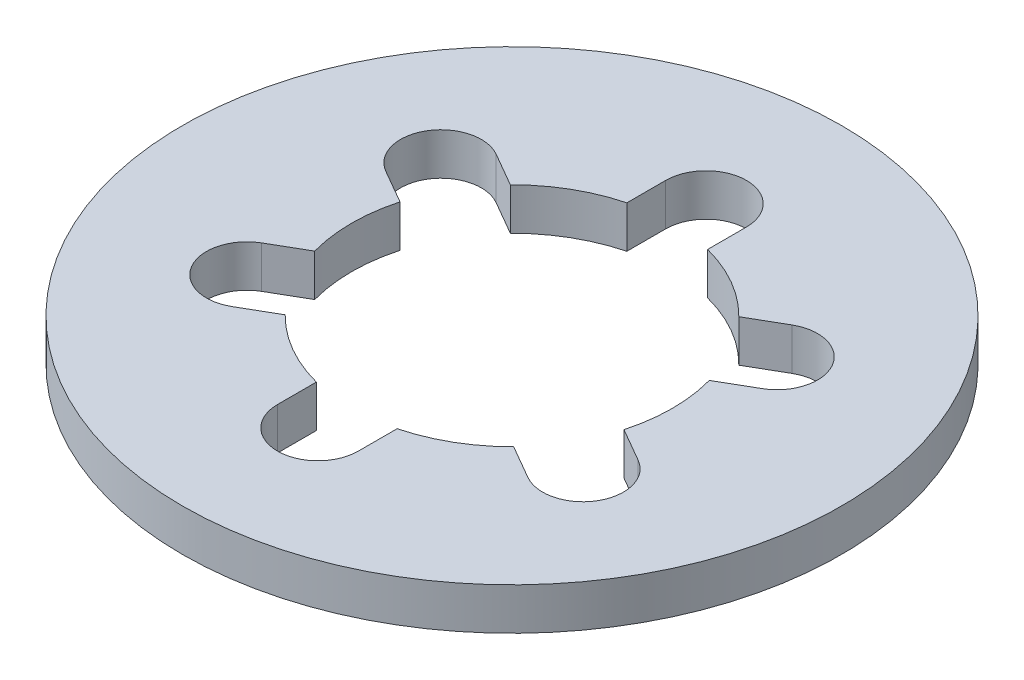
ISO-10303-21;
HEADER;
FILE_DESCRIPTION(('STEP AP214'),'2;1');
FILE_NAME('part.step','',(''),(''),'','','');
FILE_SCHEMA(('AUTOMOTIVE_DESIGN { 1 0 10303 214 1 1 1 1 }'));
ENDSEC;
DATA;
#1=APPLICATION_CONTEXT('core data for automotive mechanical design processes');
#2=APPLICATION_PROTOCOL_DEFINITION('international standard','automotive_design',2000,#1);
#3=PRODUCT_CONTEXT('',#1,'mechanical');
#4=PRODUCT('Part','Part','',(#3));
#5=PRODUCT_RELATED_PRODUCT_CATEGORY('part','',(#4));
#6=PRODUCT_DEFINITION_FORMATION('','',#4);
#7=PRODUCT_DEFINITION_CONTEXT('part definition',#1,'design');
#8=PRODUCT_DEFINITION('design','',#6,#7);
#9=PRODUCT_DEFINITION_SHAPE('','',#8);
#10=(LENGTH_UNIT() NAMED_UNIT(*) SI_UNIT(.MILLI.,.METRE.));
#11=(NAMED_UNIT(*) PLANE_ANGLE_UNIT() SI_UNIT($,.RADIAN.));
#12=(NAMED_UNIT(*) SI_UNIT($,.STERADIAN.) SOLID_ANGLE_UNIT());
#13=UNCERTAINTY_MEASURE_WITH_UNIT(LENGTH_MEASURE(1.E-05),#10,'distance_accuracy_value','');
#14=(GEOMETRIC_REPRESENTATION_CONTEXT(3) GLOBAL_UNCERTAINTY_ASSIGNED_CONTEXT((#13)) GLOBAL_UNIT_ASSIGNED_CONTEXT((#10,
#11,#12)) REPRESENTATION_CONTEXT('',''));
#15=CARTESIAN_POINT('',(0.,0.,0.));
#16=DIRECTION('',(0.,0.,1.));
#17=DIRECTION('',(1.,0.,0.));
#18=AXIS2_PLACEMENT_3D('',#15,#16,#17);
#19=CARTESIAN_POINT('',(0.,0.36,0.));
#20=DIRECTION('',(0.,-1.,0.));
#21=DIRECTION('',(0.,0.,-1.));
#22=AXIS2_PLACEMENT_3D('',#19,#20,#21);
#23=CYLINDRICAL_SURFACE('',#22,1.375);
#24=DIRECTION('',(0.,-1.,0.));
#25=VECTOR('',#24,1.);
#26=CARTESIAN_POINT('',(-1.32551033790535,0.36,0.365578095768928));
#27=LINE('',#26,#25);
#28=CARTESIAN_POINT('',(-1.32551033790535,0.,0.365578095768928));
#29=VERTEX_POINT('',#28);
#30=CARTESIAN_POINT('',(-1.32551033790535,0.36,0.365578095768928));
#31=VERTEX_POINT('',#30);
#32=EDGE_CURVE('E283',#29,#31,#27,.F.);
#33=ORIENTED_EDGE('',*,*,#32,.F.);
#34=CARTESIAN_POINT('',(0.,0.,0.));
#35=DIRECTION('',(0.,1.,0.));
#36=DIRECTION('',(0.,0.,1.));
#37=AXIS2_PLACEMENT_3D('',#34,#35,#36);
#38=CIRCLE('',#37,1.375);
#39=CARTESIAN_POINT('',(-1.32551033790535,0.,-0.365578095768938));
#40=VERTEX_POINT('',#39);
#41=EDGE_CURVE('E397',#40,#29,#38,.T.);
#42=ORIENTED_EDGE('',*,*,#41,.F.);
#43=DIRECTION('',(0.,-1.,0.));
#44=VECTOR('',#43,1.);
#45=CARTESIAN_POINT('',(-1.32551033790535,0.36,-0.365578095768938));
#46=LINE('',#45,#44);
#47=CARTESIAN_POINT('',(-1.32551033790535,0.36,-0.365578095768938));
#48=VERTEX_POINT('',#47);
#49=EDGE_CURVE('E272',#48,#40,#46,.T.);
#50=ORIENTED_EDGE('',*,*,#49,.F.);
#51=CARTESIAN_POINT('',(0.,0.36,0.));
#52=DIRECTION('',(0.,1.,0.));
#53=DIRECTION('',(0.,0.,1.));
#54=AXIS2_PLACEMENT_3D('',#51,#52,#53);
#55=CIRCLE('',#54,1.375);
#56=EDGE_CURVE('E368',#48,#31,#55,.T.);
#57=ORIENTED_EDGE('',*,*,#56,.T.);
#58=EDGE_LOOP('',(#33,#42,#50,#57));
#59=FACE_BOUND('',#58,.T.);
#60=ADVANCED_FACE('F33',(#59),#23,.F.);
#61=DIRECTION('',(0.,-1.,0.));
#62=VECTOR('',#61,1.);
#63=CARTESIAN_POINT('',(-0.979355086955707,0.36,-0.965136577720469));
#64=LINE('',#63,#62);
#65=CARTESIAN_POINT('',(-0.979355086955707,0.,-0.965136577720469));
#66=VERTEX_POINT('',#65);
#67=CARTESIAN_POINT('',(-0.979355086955707,0.36,-0.965136577720469));
#68=VERTEX_POINT('',#67);
#69=EDGE_CURVE('E280',#66,#68,#64,.F.);
#70=ORIENTED_EDGE('',*,*,#69,.F.);
#71=CARTESIAN_POINT('',(-0.346155250949641,0.,-1.3307146734894));
#72=VERTEX_POINT('',#71);
#73=EDGE_CURVE('E330',#72,#66,#38,.T.);
#74=ORIENTED_EDGE('',*,*,#73,.F.);
#75=DIRECTION('',(0.,-1.,0.));
#76=VECTOR('',#75,1.);
#77=CARTESIAN_POINT('',(-0.346155250949641,0.36,-1.3307146734894));
#78=LINE('',#77,#76);
#79=CARTESIAN_POINT('',(-0.346155250949641,0.36,-1.3307146734894));
#80=VERTEX_POINT('',#79);
#81=EDGE_CURVE('E344',#80,#72,#78,.T.);
#82=ORIENTED_EDGE('',*,*,#81,.F.);
#83=EDGE_CURVE('E327',#80,#68,#55,.T.);
#84=ORIENTED_EDGE('',*,*,#83,.T.);
#85=EDGE_LOOP('',(#70,#74,#82,#84));
#86=FACE_BOUND('',#85,.T.);
#87=ADVANCED_FACE('F428',(#86),#23,.F.);
#88=DIRECTION('',(0.,-1.,0.));
#89=VECTOR('',#88,1.);
#90=CARTESIAN_POINT('',(0.979355086955713,0.36,-0.965136577720462));
#91=LINE('',#90,#89);
#92=CARTESIAN_POINT('',(0.979355086955714,0.36,-0.965136577720462));
#93=VERTEX_POINT('',#92);
#94=CARTESIAN_POINT('',(0.979355086955714,0.,-0.965136577720462));
#95=VERTEX_POINT('',#94);
#96=EDGE_CURVE('E11',#93,#95,#91,.T.);
#97=ORIENTED_EDGE('',*,*,#96,.F.);
#98=CARTESIAN_POINT('',(0.346155250949641,0.36,-1.3307146734894));
#99=VERTEX_POINT('',#98);
#100=EDGE_CURVE('E367',#93,#99,#55,.T.);
#101=ORIENTED_EDGE('',*,*,#100,.T.);
#102=DIRECTION('',(0.,-1.,0.));
#103=VECTOR('',#102,1.);
#104=CARTESIAN_POINT('',(0.346155250949641,0.36,-1.3307146734894));
#105=LINE('',#104,#103);
#106=CARTESIAN_POINT('',(0.346155250949641,0.,-1.3307146734894));
#107=VERTEX_POINT('',#106);
#108=EDGE_CURVE('E334',#107,#99,#105,.F.);
#109=ORIENTED_EDGE('',*,*,#108,.F.);
#110=EDGE_CURVE('E399',#95,#107,#38,.T.);
#111=ORIENTED_EDGE('',*,*,#110,.F.);
#112=EDGE_LOOP('',(#97,#101,#109,#111));
#113=FACE_BOUND('',#112,.T.);
#114=ADVANCED_FACE('F433',(#113),#23,.F.);
#115=DIRECTION('',(0.,-1.,0.));
#116=VECTOR('',#115,1.);
#117=CARTESIAN_POINT('',(0.979355086955707,0.36,0.965136577720469));
#118=LINE('',#117,#116);
#119=CARTESIAN_POINT('',(0.979355086955708,0.,0.96513657772047));
#120=VERTEX_POINT('',#119);
#121=CARTESIAN_POINT('',(0.979355086955708,0.36,0.96513657772047));
#122=VERTEX_POINT('',#121);
#123=EDGE_CURVE('E348',#120,#122,#118,.F.);
#124=ORIENTED_EDGE('',*,*,#123,.F.);
#125=CARTESIAN_POINT('',(0.346155250949641,0.,1.3307146734894));
#126=VERTEX_POINT('',#125);
#127=EDGE_CURVE('E221',#126,#120,#38,.T.);
#128=ORIENTED_EDGE('',*,*,#127,.F.);
#129=DIRECTION('',(0.,-1.,0.));
#130=VECTOR('',#129,1.);
#131=CARTESIAN_POINT('',(0.346155250949641,0.36,1.3307146734894));
#132=LINE('',#131,#130);
#133=CARTESIAN_POINT('',(0.346155250949641,0.36,1.3307146734894));
#134=VERTEX_POINT('',#133);
#135=EDGE_CURVE('E339',#134,#126,#132,.T.);
#136=ORIENTED_EDGE('',*,*,#135,.F.);
#137=EDGE_CURVE('E321',#134,#122,#55,.T.);
#138=ORIENTED_EDGE('',*,*,#137,.T.);
#139=EDGE_LOOP('',(#124,#128,#136,#138));
#140=FACE_BOUND('',#139,.T.);
#141=ADVANCED_FACE('F410',(#140),#23,.F.);
#142=DIRECTION('',(0.,-1.,0.));
#143=VECTOR('',#142,1.);
#144=CARTESIAN_POINT('',(-0.979355086955713,0.36,0.965136577720462));
#145=LINE('',#144,#143);
#146=CARTESIAN_POINT('',(-0.979355086955714,0.36,0.965136577720462));
#147=VERTEX_POINT('',#146);
#148=CARTESIAN_POINT('',(-0.979355086955714,0.,0.965136577720462));
#149=VERTEX_POINT('',#148);
#150=EDGE_CURVE('E56',#147,#149,#145,.T.);
#151=ORIENTED_EDGE('',*,*,#150,.F.);
#152=CARTESIAN_POINT('',(-0.346155250949641,0.36,1.3307146734894));
#153=VERTEX_POINT('',#152);
#154=EDGE_CURVE('E326',#147,#153,#55,.T.);
#155=ORIENTED_EDGE('',*,*,#154,.T.);
#156=DIRECTION('',(0.,-1.,0.));
#157=VECTOR('',#156,1.);
#158=CARTESIAN_POINT('',(-0.346155250949641,0.36,1.3307146734894));
#159=LINE('',#158,#157);
#160=CARTESIAN_POINT('',(-0.346155250949641,0.,1.3307146734894));
#161=VERTEX_POINT('',#160);
#162=EDGE_CURVE('E341',#161,#153,#159,.F.);
#163=ORIENTED_EDGE('',*,*,#162,.F.);
#164=EDGE_CURVE('E314',#149,#161,#38,.T.);
#165=ORIENTED_EDGE('',*,*,#164,.F.);
#166=EDGE_LOOP('',(#151,#155,#163,#165));
#167=FACE_BOUND('',#166,.T.);
#168=ADVANCED_FACE('F382',(#167),#23,.F.);
#169=CARTESIAN_POINT('',(0.,0.36,0.));
#170=DIRECTION('',(0.,1.,0.));
#171=DIRECTION('',(0.,0.,1.));
#172=AXIS2_PLACEMENT_3D('',#169,#170,#171);
#173=PLANE('',#172);
#174=DIRECTION('',(-0.86602540378444,0.,0.499999999999998));
#175=VECTOR('',#174,1.);
#176=CARTESIAN_POINT('',(-1.6139520417777,0.36,0.532109991145144));
#177=LINE('',#176,#175);
#178=CARTESIAN_POINT('',(1.26779679082806,0.36,-1.13166847309668));
#179=VERTEX_POINT('',#178);
#180=EDGE_CURVE('E249',#179,#93,#177,.T.);
#181=ORIENTED_EDGE('',*,*,#180,.F.);
#182=CARTESIAN_POINT('',(1.44087441630288,0.36,-0.831889232120911));
#183=DIRECTION('',(0.,1.,0.));
#184=DIRECTION('',(-0.86602540378444,0.,0.499999999999998));
#185=AXIS2_PLACEMENT_3D('',#182,#183,#184);
#186=CIRCLE('',#185,0.346155250949641);
#187=CARTESIAN_POINT('',(1.6139520417777,0.36,-0.532109991145144));
#188=VERTEX_POINT('',#187);
#189=EDGE_CURVE('E264',#188,#179,#186,.T.);
#190=ORIENTED_EDGE('',*,*,#189,.F.);
#191=DIRECTION('',(0.86602540378444,0.,-0.499999999999998));
#192=VECTOR('',#191,1.);
#193=CARTESIAN_POINT('',(-1.26779679082806,0.36,1.13166847309668));
#194=LINE('',#193,#192);
#195=CARTESIAN_POINT('',(1.32551033790535,0.36,-0.365578095768929));
#196=VERTEX_POINT('',#195);
#197=EDGE_CURVE('E261',#196,#188,#194,.T.);
#198=ORIENTED_EDGE('',*,*,#197,.F.);
#199=CARTESIAN_POINT('',(1.32551033790535,0.36,0.365578095768937));
#200=VERTEX_POINT('',#199);
#201=EDGE_CURVE('E325',#200,#196,#55,.T.);
#202=ORIENTED_EDGE('',*,*,#201,.F.);
#203=DIRECTION('',(-0.866025403784436,0.,-0.500000000000004));
#204=VECTOR('',#203,1.);
#205=CARTESIAN_POINT('',(-1.26779679082806,0.36,-1.13166847309669));
#206=LINE('',#205,#204);
#207=CARTESIAN_POINT('',(1.6139520417777,0.36,0.532109991145155));
#208=VERTEX_POINT('',#207);
#209=EDGE_CURVE('E225',#208,#200,#206,.T.);
#210=ORIENTED_EDGE('',*,*,#209,.F.);
#211=CARTESIAN_POINT('',(1.44087441630288,0.36,0.831889232120921));
#212=DIRECTION('',(0.,1.,0.));
#213=DIRECTION('',(-0.866025403784436,0.,-0.500000000000004));
#214=AXIS2_PLACEMENT_3D('',#211,#212,#213);
#215=CIRCLE('',#214,0.346155250949641);
#216=CARTESIAN_POINT('',(1.26779679082806,0.36,1.13166847309669));
#217=VERTEX_POINT('',#216);
#218=EDGE_CURVE('E235',#217,#208,#215,.T.);
#219=ORIENTED_EDGE('',*,*,#218,.F.);
#220=DIRECTION('',(0.866025403784436,0.,0.500000000000004));
#221=VECTOR('',#220,1.);
#222=CARTESIAN_POINT('',(-1.6139520417777,0.36,-0.532109991145155));
#223=LINE('',#222,#221);
#224=EDGE_CURVE('E200',#122,#217,#223,.T.);
#225=ORIENTED_EDGE('',*,*,#224,.F.);
#226=ORIENTED_EDGE('',*,*,#137,.F.);
#227=DIRECTION('',(0.,0.,-1.));
#228=VECTOR('',#227,1.);
#229=CARTESIAN_POINT('',(0.346155250949641,0.36,1.66377846424183));
#230=LINE('',#229,#228);
#231=CARTESIAN_POINT('',(0.346155250949641,0.36,1.66377846424183));
#232=VERTEX_POINT('',#231);
#233=EDGE_CURVE('E304',#232,#134,#230,.T.);
#234=ORIENTED_EDGE('',*,*,#233,.F.);
#235=CARTESIAN_POINT('',(0.,0.36,1.66377846424183));
#236=DIRECTION('',(0.,1.,0.));
#237=DIRECTION('',(0.,0.,1.));
#238=AXIS2_PLACEMENT_3D('',#235,#236,#237);
#239=CIRCLE('',#238,0.346155250949641);
#240=CARTESIAN_POINT('',(-0.346155250949641,0.36,1.66377846424183));
#241=VERTEX_POINT('',#240);
#242=EDGE_CURVE('E285',#241,#232,#239,.T.);
#243=ORIENTED_EDGE('',*,*,#242,.F.);
#244=DIRECTION('',(0.,0.,1.));
#245=VECTOR('',#244,1.);
#246=CARTESIAN_POINT('',(-0.346155250949641,0.36,1.66377846424183));
#247=LINE('',#246,#245);
#248=EDGE_CURVE('E309',#153,#241,#247,.T.);
#249=ORIENTED_EDGE('',*,*,#248,.F.);
#250=ORIENTED_EDGE('',*,*,#154,.F.);
#251=CARTESIAN_POINT('',(-1.26779679082806,0.36,1.13166847309668));
#252=VERTEX_POINT('',#251);
#253=EDGE_CURVE('E262',#252,#147,#194,.T.);
#254=ORIENTED_EDGE('',*,*,#253,.F.);
#255=CARTESIAN_POINT('',(-1.44087441630288,0.36,0.831889232120911));
#256=DIRECTION('',(0.,1.,0.));
#257=DIRECTION('',(-0.86602540378444,0.,0.499999999999998));
#258=AXIS2_PLACEMENT_3D('',#255,#256,#257);
#259=CIRCLE('',#258,0.346155250949641);
#260=CARTESIAN_POINT('',(-1.6139520417777,0.36,0.532109991145144));
#261=VERTEX_POINT('',#260);
#262=EDGE_CURVE('E242',#261,#252,#259,.T.);
#263=ORIENTED_EDGE('',*,*,#262,.F.);
#264=EDGE_CURVE('E267',#31,#261,#177,.T.);
#265=ORIENTED_EDGE('',*,*,#264,.F.);
#266=ORIENTED_EDGE('',*,*,#56,.F.);
#267=CARTESIAN_POINT('',(-1.6139520417777,0.36,-0.532109991145155));
#268=VERTEX_POINT('',#267);
#269=EDGE_CURVE('E233',#268,#48,#223,.T.);
#270=ORIENTED_EDGE('',*,*,#269,.F.);
#271=CARTESIAN_POINT('',(-1.44087441630288,0.36,-0.831889232120921));
#272=DIRECTION('',(0.,1.,0.));
#273=DIRECTION('',(-0.866025403784436,0.,-0.500000000000004));
#274=AXIS2_PLACEMENT_3D('',#271,#272,#273);
#275=CIRCLE('',#274,0.346155250949641);
#276=CARTESIAN_POINT('',(-1.26779679082806,0.36,-1.13166847309669));
#277=VERTEX_POINT('',#276);
#278=EDGE_CURVE('E230',#277,#268,#275,.T.);
#279=ORIENTED_EDGE('',*,*,#278,.F.);
#280=EDGE_CURVE('E237',#68,#277,#206,.T.);
#281=ORIENTED_EDGE('',*,*,#280,.F.);
#282=ORIENTED_EDGE('',*,*,#83,.F.);
#283=CARTESIAN_POINT('',(-0.346155250949641,0.36,-1.66377846424183));
#284=VERTEX_POINT('',#283);
#285=EDGE_CURVE('E290',#284,#80,#247,.T.);
#286=ORIENTED_EDGE('',*,*,#285,.F.);
#287=CARTESIAN_POINT('',(0.,0.36,-1.66377846424183));
#288=DIRECTION('',(0.,1.,0.));
#289=DIRECTION('',(0.,0.,1.));
#290=AXIS2_PLACEMENT_3D('',#287,#288,#289);
#291=CIRCLE('',#290,0.346155250949641);
#292=CARTESIAN_POINT('',(0.346155250949641,0.36,-1.66377846424183));
#293=VERTEX_POINT('',#292);
#294=EDGE_CURVE('E306',#293,#284,#291,.T.);
#295=ORIENTED_EDGE('',*,*,#294,.F.);
#296=EDGE_CURVE('E303',#99,#293,#230,.T.);
#297=ORIENTED_EDGE('',*,*,#296,.F.);
#298=ORIENTED_EDGE('',*,*,#100,.F.);
#299=EDGE_LOOP('',(#181,#190,#198,#202,#210,#219,#225,#226,#234,#243,#249,#250,#254,#263,#265,
#266,#270,#279,#281,#282,#286,#295,#297,#298));
#300=FACE_BOUND('',#299,.T.);
#301=CARTESIAN_POINT('',(0.,0.36,0.));
#302=DIRECTION('',(0.,1.,0.));
#303=DIRECTION('',(0.,0.,1.));
#304=AXIS2_PLACEMENT_3D('',#301,#302,#303);
#305=CIRCLE('',#304,2.825);
#306=CARTESIAN_POINT('',(0.,0.36,-2.825));
#307=VERTEX_POINT('',#306);
#308=EDGE_CURVE('E331',#307,#307,#305,.T.);
#309=ORIENTED_EDGE('',*,*,#308,.T.);
#310=EDGE_LOOP('',(#309));
#311=FACE_BOUND('',#310,.T.);
#312=ADVANCED_FACE('F362',(#300,#311),#173,.T.);
#313=CARTESIAN_POINT('',(0.,0.,0.));
#314=DIRECTION('',(0.,1.,0.));
#315=DIRECTION('',(0.,0.,1.));
#316=AXIS2_PLACEMENT_3D('',#313,#314,#315);
#317=PLANE('',#316);
#318=CARTESIAN_POINT('',(1.44087441630288,0.,-0.831889232120911));
#319=DIRECTION('',(0.,1.,0.));
#320=DIRECTION('',(-0.86602540378444,0.,0.499999999999998));
#321=AXIS2_PLACEMENT_3D('',#318,#319,#320);
#322=CIRCLE('',#321,0.346155250949641);
#323=CARTESIAN_POINT('',(1.6139520417777,0.,-0.532109991145144));
#324=VERTEX_POINT('',#323);
#325=CARTESIAN_POINT('',(1.26779679082806,0.,-1.13166847309668));
#326=VERTEX_POINT('',#325);
#327=EDGE_CURVE('E252',#324,#326,#322,.T.);
#328=ORIENTED_EDGE('',*,*,#327,.T.);
#329=DIRECTION('',(-0.86602540378444,0.,0.499999999999998));
#330=VECTOR('',#329,1.);
#331=CARTESIAN_POINT('',(-1.6139520417777,0.,0.532109991145144));
#332=LINE('',#331,#330);
#333=EDGE_CURVE('E255',#326,#95,#332,.T.);
#334=ORIENTED_EDGE('',*,*,#333,.T.);
#335=ORIENTED_EDGE('',*,*,#110,.T.);
#336=DIRECTION('',(0.,0.,-1.));
#337=VECTOR('',#336,1.);
#338=CARTESIAN_POINT('',(0.346155250949641,0.,1.66377846424183));
#339=LINE('',#338,#337);
#340=CARTESIAN_POINT('',(0.346155250949641,0.,-1.66377846424183));
#341=VERTEX_POINT('',#340);
#342=EDGE_CURVE('E289',#107,#341,#339,.T.);
#343=ORIENTED_EDGE('',*,*,#342,.T.);
#344=CARTESIAN_POINT('',(0.,0.,-1.66377846424183));
#345=DIRECTION('',(0.,1.,0.));
#346=DIRECTION('',(0.,0.,1.));
#347=AXIS2_PLACEMENT_3D('',#344,#345,#346);
#348=CIRCLE('',#347,0.346155250949641);
#349=CARTESIAN_POINT('',(-0.346155250949641,0.,-1.66377846424183));
#350=VERTEX_POINT('',#349);
#351=EDGE_CURVE('E293',#341,#350,#348,.T.);
#352=ORIENTED_EDGE('',*,*,#351,.T.);
#353=DIRECTION('',(0.,0.,1.));
#354=VECTOR('',#353,1.);
#355=CARTESIAN_POINT('',(-0.346155250949641,0.,1.66377846424183));
#356=LINE('',#355,#354);
#357=EDGE_CURVE('E297',#350,#72,#356,.T.);
#358=ORIENTED_EDGE('',*,*,#357,.T.);
#359=ORIENTED_EDGE('',*,*,#73,.T.);
#360=DIRECTION('',(-0.866025403784436,0.,-0.500000000000004));
#361=VECTOR('',#360,1.);
#362=CARTESIAN_POINT('',(-1.26779679082806,0.,-1.13166847309669));
#363=LINE('',#362,#361);
#364=CARTESIAN_POINT('',(-1.26779679082806,0.,-1.13166847309669));
#365=VERTEX_POINT('',#364);
#366=EDGE_CURVE('E213',#66,#365,#363,.T.);
#367=ORIENTED_EDGE('',*,*,#366,.T.);
#368=CARTESIAN_POINT('',(-1.44087441630288,0.,-0.831889232120921));
#369=DIRECTION('',(0.,1.,0.));
#370=DIRECTION('',(-0.866025403784436,0.,-0.500000000000004));
#371=AXIS2_PLACEMENT_3D('',#368,#369,#370);
#372=CIRCLE('',#371,0.346155250949641);
#373=CARTESIAN_POINT('',(-1.6139520417777,0.,-0.532109991145155));
#374=VERTEX_POINT('',#373);
#375=EDGE_CURVE('E222',#365,#374,#372,.T.);
#376=ORIENTED_EDGE('',*,*,#375,.T.);
#377=DIRECTION('',(0.866025403784436,0.,0.500000000000004));
#378=VECTOR('',#377,1.);
#379=CARTESIAN_POINT('',(-1.6139520417777,0.,-0.532109991145155));
#380=LINE('',#379,#378);
#381=EDGE_CURVE('E48',#374,#40,#380,.T.);
#382=ORIENTED_EDGE('',*,*,#381,.T.);
#383=ORIENTED_EDGE('',*,*,#41,.T.);
#384=CARTESIAN_POINT('',(-1.6139520417777,0.,0.532109991145144));
#385=VERTEX_POINT('',#384);
#386=EDGE_CURVE('E254',#29,#385,#332,.T.);
#387=ORIENTED_EDGE('',*,*,#386,.T.);
#388=CARTESIAN_POINT('',(-1.44087441630288,0.,0.831889232120911));
#389=DIRECTION('',(0.,1.,0.));
#390=DIRECTION('',(-0.86602540378444,0.,0.499999999999998));
#391=AXIS2_PLACEMENT_3D('',#388,#389,#390);
#392=CIRCLE('',#391,0.346155250949641);
#393=CARTESIAN_POINT('',(-1.26779679082806,0.,1.13166847309668));
#394=VERTEX_POINT('',#393);
#395=EDGE_CURVE('E245',#385,#394,#392,.T.);
#396=ORIENTED_EDGE('',*,*,#395,.T.);
#397=DIRECTION('',(0.86602540378444,0.,-0.499999999999998));
#398=VECTOR('',#397,1.);
#399=CARTESIAN_POINT('',(-1.26779679082806,0.,1.13166847309668));
#400=LINE('',#399,#398);
#401=EDGE_CURVE('E250',#394,#149,#400,.T.);
#402=ORIENTED_EDGE('',*,*,#401,.T.);
#403=ORIENTED_EDGE('',*,*,#164,.T.);
#404=CARTESIAN_POINT('',(-0.346155250949641,0.,1.66377846424183));
#405=VERTEX_POINT('',#404);
#406=EDGE_CURVE('E296',#161,#405,#356,.T.);
#407=ORIENTED_EDGE('',*,*,#406,.T.);
#408=CARTESIAN_POINT('',(0.,0.,1.66377846424183));
#409=DIRECTION('',(0.,1.,0.));
#410=DIRECTION('',(0.,0.,1.));
#411=AXIS2_PLACEMENT_3D('',#408,#409,#410);
#412=CIRCLE('',#411,0.346155250949641);
#413=CARTESIAN_POINT('',(0.346155250949641,0.,1.66377846424183));
#414=VERTEX_POINT('',#413);
#415=EDGE_CURVE('E286',#405,#414,#412,.T.);
#416=ORIENTED_EDGE('',*,*,#415,.T.);
#417=EDGE_CURVE('E291',#414,#126,#339,.T.);
#418=ORIENTED_EDGE('',*,*,#417,.T.);
#419=ORIENTED_EDGE('',*,*,#127,.T.);
#420=CARTESIAN_POINT('',(1.26779679082806,0.,1.13166847309669));
#421=VERTEX_POINT('',#420);
#422=EDGE_CURVE('E197',#120,#421,#380,.T.);
#423=ORIENTED_EDGE('',*,*,#422,.T.);
#424=CARTESIAN_POINT('',(1.44087441630288,0.,0.831889232120921));
#425=DIRECTION('',(0.,1.,0.));
#426=DIRECTION('',(-0.866025403784436,0.,-0.500000000000004));
#427=AXIS2_PLACEMENT_3D('',#424,#425,#426);
#428=CIRCLE('',#427,0.346155250949641);
#429=CARTESIAN_POINT('',(1.6139520417777,0.,0.532109991145155));
#430=VERTEX_POINT('',#429);
#431=EDGE_CURVE('E208',#421,#430,#428,.T.);
#432=ORIENTED_EDGE('',*,*,#431,.T.);
#433=CARTESIAN_POINT('',(1.32551033790535,0.,0.365578095768938));
#434=VERTEX_POINT('',#433);
#435=EDGE_CURVE('E228',#430,#434,#363,.T.);
#436=ORIENTED_EDGE('',*,*,#435,.T.);
#437=CARTESIAN_POINT('',(1.32551033790535,0.,-0.365578095768929));
#438=VERTEX_POINT('',#437);
#439=EDGE_CURVE('E329',#434,#438,#38,.T.);
#440=ORIENTED_EDGE('',*,*,#439,.T.);
#441=EDGE_CURVE('E248',#438,#324,#400,.T.);
#442=ORIENTED_EDGE('',*,*,#441,.T.);
#443=EDGE_LOOP('',(#328,#334,#335,#343,#352,#358,#359,#367,#376,#382,#383,#387,#396,#402,#403,
#407,#416,#418,#419,#423,#432,#436,#440,#442));
#444=FACE_BOUND('',#443,.T.);
#445=CARTESIAN_POINT('',(0.,0.,0.));
#446=DIRECTION('',(0.,1.,0.));
#447=DIRECTION('',(0.,0.,1.));
#448=AXIS2_PLACEMENT_3D('',#445,#446,#447);
#449=CIRCLE('',#448,2.825);
#450=CARTESIAN_POINT('',(0.,0.,-2.825));
#451=VERTEX_POINT('',#450);
#452=EDGE_CURVE('E324',#451,#451,#449,.T.);
#453=ORIENTED_EDGE('',*,*,#452,.F.);
#454=EDGE_LOOP('',(#453));
#455=FACE_BOUND('',#454,.T.);
#456=ADVANCED_FACE('F217',(#444,#455),#317,.F.);
#457=CARTESIAN_POINT('',(0.,0.36,0.));
#458=DIRECTION('',(0.,-1.,0.));
#459=DIRECTION('',(0.,0.,-1.));
#460=AXIS2_PLACEMENT_3D('',#457,#458,#459);
#461=CYLINDRICAL_SURFACE('',#460,2.825);
#462=CARTESIAN_POINT('',(0.,0.36,-2.825));
#463=CARTESIAN_POINT('',(0.,0.35625,-2.825));
#464=CARTESIAN_POINT('',(0.,0.3525,-2.825));
#465=CARTESIAN_POINT('',(0.,0.345,-2.825));
#466=CARTESIAN_POINT('',(0.,0.34125,-2.825));
#467=CARTESIAN_POINT('',(0.,0.33375,-2.825));
#468=CARTESIAN_POINT('',(0.,0.33,-2.825));
#469=CARTESIAN_POINT('',(0.,0.3225,-2.825));
#470=CARTESIAN_POINT('',(0.,0.31875,-2.825));
#471=CARTESIAN_POINT('',(0.,0.31125,-2.825));
#472=CARTESIAN_POINT('',(0.,0.3075,-2.825));
#473=CARTESIAN_POINT('',(0.,0.3,-2.825));
#474=CARTESIAN_POINT('',(0.,0.29625,-2.825));
#475=CARTESIAN_POINT('',(0.,0.28875,-2.825));
#476=CARTESIAN_POINT('',(0.,0.285,-2.825));
#477=CARTESIAN_POINT('',(0.,0.2775,-2.825));
#478=CARTESIAN_POINT('',(0.,0.27375,-2.825));
#479=CARTESIAN_POINT('',(0.,0.26625,-2.825));
#480=CARTESIAN_POINT('',(0.,0.2625,-2.825));
#481=CARTESIAN_POINT('',(0.,0.255,-2.825));
#482=CARTESIAN_POINT('',(0.,0.25125,-2.825));
#483=CARTESIAN_POINT('',(0.,0.24375,-2.825));
#484=CARTESIAN_POINT('',(0.,0.24,-2.825));
#485=CARTESIAN_POINT('',(0.,0.2325,-2.825));
#486=CARTESIAN_POINT('',(0.,0.22875,-2.825));
#487=CARTESIAN_POINT('',(0.,0.22125,-2.825));
#488=CARTESIAN_POINT('',(0.,0.2175,-2.825));
#489=CARTESIAN_POINT('',(0.,0.21,-2.825));
#490=CARTESIAN_POINT('',(0.,0.20625,-2.825));
#491=CARTESIAN_POINT('',(0.,0.19875,-2.825));
#492=CARTESIAN_POINT('',(0.,0.195,-2.825));
#493=CARTESIAN_POINT('',(0.,0.1875,-2.825));
#494=CARTESIAN_POINT('',(0.,0.18375,-2.825));
#495=CARTESIAN_POINT('',(0.,0.17625,-2.825));
#496=CARTESIAN_POINT('',(0.,0.1725,-2.825));
#497=CARTESIAN_POINT('',(0.,0.165,-2.825));
#498=CARTESIAN_POINT('',(0.,0.16125,-2.825));
#499=CARTESIAN_POINT('',(0.,0.15375,-2.825));
#500=CARTESIAN_POINT('',(0.,0.15,-2.825));
#501=CARTESIAN_POINT('',(0.,0.1425,-2.825));
#502=CARTESIAN_POINT('',(0.,0.13875,-2.825));
#503=CARTESIAN_POINT('',(0.,0.13125,-2.825));
#504=CARTESIAN_POINT('',(0.,0.1275,-2.825));
#505=CARTESIAN_POINT('',(0.,0.12,-2.825));
#506=CARTESIAN_POINT('',(0.,0.11625,-2.825));
#507=CARTESIAN_POINT('',(0.,0.10875,-2.825));
#508=CARTESIAN_POINT('',(0.,0.105,-2.825));
#509=CARTESIAN_POINT('',(0.,0.0974999999999999,-2.825));
#510=CARTESIAN_POINT('',(0.,0.09375,-2.825));
#511=CARTESIAN_POINT('',(0.,0.08625,-2.825));
#512=CARTESIAN_POINT('',(0.,0.0824999999999999,-2.825));
#513=CARTESIAN_POINT('',(0.,0.0749999999999999,-2.825));
#514=CARTESIAN_POINT('',(0.,0.07125,-2.825));
#515=CARTESIAN_POINT('',(0.,0.0637499999999999,-2.825));
#516=CARTESIAN_POINT('',(0.,0.0599999999999999,-2.825));
#517=CARTESIAN_POINT('',(0.,0.0524999999999999,-2.825));
#518=CARTESIAN_POINT('',(0.,0.0487499999999999,-2.825));
#519=CARTESIAN_POINT('',(0.,0.0412499999999999,-2.825));
#520=CARTESIAN_POINT('',(0.,0.0374999999999999,-2.825));
#521=CARTESIAN_POINT('',(0.,0.0299999999999999,-2.825));
#522=CARTESIAN_POINT('',(0.,0.0262499999999999,-2.825));
#523=CARTESIAN_POINT('',(0.,0.0187499999999999,-2.825));
#524=CARTESIAN_POINT('',(0.,0.0149999999999999,-2.825));
#525=CARTESIAN_POINT('',(0.,0.00749999999999993,-2.825));
#526=CARTESIAN_POINT('',(0.,0.00374999999999994,-2.825));
#527=CARTESIAN_POINT('',(0.,0.,-2.825));
#528=B_SPLINE_CURVE_WITH_KNOTS('',3,(#462,#463,#464,#465,#466,#467,#468,#469,#470,#471,#472,
#473,#474,#475,#476,#477,#478,#479,#480,#481,#482,#483,#484,#485,#486,#487,#488,#489,#490,#491,
#492,#493,#494,#495,#496,#497,#498,#499,#500,#501,#502,#503,#504,#505,#506,#507,#508,#509,#510,
#511,#512,#513,#514,#515,#516,#517,#518,#519,#520,#521,#522,#523,#524,#525,#526,#527),
.UNSPECIFIED.,.F.,.F.,(4,2,2,2,2,2,2,2,2,2,2,2,2,2,2,2,2,2,2,2,2,2,2,2,2,2,2,2,2,2,2,2,4),(0.,
0.01125,0.0225,0.03375,0.045,0.05625,0.0675,0.07875,0.09,0.10125,0.1125,0.12375,0.135,0.14625,
0.1575,0.16875,0.18,0.19125,0.2025,0.21375,0.225,0.23625,0.2475,0.25875,0.27,0.28125,0.2925,
0.30375,0.315,0.32625,0.3375,0.34875,0.36),.UNSPECIFIED.);
#529=EDGE_CURVE('BSEAM35',#307,#451,#528,.T.);
#530=ORIENTED_EDGE('',*,*,#308,.F.);
#531=ORIENTED_EDGE('',*,*,#452,.T.);
#532=ORIENTED_EDGE('',*,*,#529,.T.);
#533=ORIENTED_EDGE('',*,*,#529,.F.);
#534=EDGE_LOOP('',(#530,#532,#531,#533));
#535=FACE_BOUND('',#534,.T.);
#536=ADVANCED_FACE('F35',(#535),#461,.T.);
#537=DIRECTION('',(0.,-1.,0.));
#538=VECTOR('',#537,1.);
#539=CARTESIAN_POINT('',(1.32551033790535,0.36,-0.365578095768928));
#540=LINE('',#539,#538);
#541=EDGE_CURVE('E41',#438,#196,#540,.F.);
#542=ORIENTED_EDGE('',*,*,#541,.F.);
#543=ORIENTED_EDGE('',*,*,#439,.F.);
#544=DIRECTION('',(0.,-1.,0.));
#545=VECTOR('',#544,1.);
#546=CARTESIAN_POINT('',(1.32551033790535,0.36,0.365578095768937));
#547=LINE('',#546,#545);
#548=EDGE_CURVE('E346',#200,#434,#547,.T.);
#549=ORIENTED_EDGE('',*,*,#548,.F.);
#550=ORIENTED_EDGE('',*,*,#201,.T.);
#551=EDGE_LOOP('',(#542,#543,#549,#550));
#552=FACE_BOUND('',#551,.T.);
#553=ADVANCED_FACE('F366',(#552),#23,.F.);
#554=CARTESIAN_POINT('',(-0.346155250949641,0.,1.66377846424183));
#555=DIRECTION('',(-1.,0.,0.));
#556=DIRECTION('',(0.,0.,1.));
#557=AXIS2_PLACEMENT_3D('',#554,#555,#556);
#558=PLANE('',#557);
#559=ORIENTED_EDGE('',*,*,#81,.T.);
#560=ORIENTED_EDGE('',*,*,#357,.F.);
#561=DIRECTION('',(0.,1.,0.));
#562=VECTOR('',#561,1.);
#563=CARTESIAN_POINT('',(-0.346155250949641,0.,-1.66377846424183));
#564=LINE('',#563,#562);
#565=EDGE_CURVE('E315',#350,#284,#564,.T.);
#566=ORIENTED_EDGE('',*,*,#565,.T.);
#567=ORIENTED_EDGE('',*,*,#285,.T.);
#568=EDGE_LOOP('',(#559,#560,#566,#567));
#569=FACE_BOUND('',#568,.T.);
#570=ADVANCED_FACE('F425',(#569),#558,.F.);
#571=CARTESIAN_POINT('',(0.346155250949641,0.,1.66377846424183));
#572=DIRECTION('',(1.,0.,0.));
#573=DIRECTION('',(0.,0.,-1.));
#574=AXIS2_PLACEMENT_3D('',#571,#572,#573);
#575=PLANE('',#574);
#576=ORIENTED_EDGE('',*,*,#108,.T.);
#577=ORIENTED_EDGE('',*,*,#296,.T.);
#578=DIRECTION('',(0.,1.,0.));
#579=VECTOR('',#578,1.);
#580=CARTESIAN_POINT('',(0.346155250949641,0.,-1.66377846424183));
#581=LINE('',#580,#579);
#582=EDGE_CURVE('E317',#341,#293,#581,.T.);
#583=ORIENTED_EDGE('',*,*,#582,.F.);
#584=ORIENTED_EDGE('',*,*,#342,.F.);
#585=EDGE_LOOP('',(#576,#577,#583,#584));
#586=FACE_BOUND('',#585,.T.);
#587=ADVANCED_FACE('F416',(#586),#575,.F.);
#588=CARTESIAN_POINT('',(0.,0.,-1.66377846424183));
#589=DIRECTION('',(0.,1.,0.));
#590=DIRECTION('',(0.,0.,1.));
#591=AXIS2_PLACEMENT_3D('',#588,#589,#590);
#592=CYLINDRICAL_SURFACE('',#591,0.346155250949641);
#593=ORIENTED_EDGE('',*,*,#294,.T.);
#594=ORIENTED_EDGE('',*,*,#565,.F.);
#595=ORIENTED_EDGE('',*,*,#351,.F.);
#596=ORIENTED_EDGE('',*,*,#582,.T.);
#597=EDGE_LOOP('',(#593,#594,#595,#596));
#598=FACE_BOUND('',#597,.T.);
#599=ADVANCED_FACE('F414',(#598),#592,.F.);
#600=ORIENTED_EDGE('',*,*,#135,.T.);
#601=ORIENTED_EDGE('',*,*,#417,.F.);
#602=DIRECTION('',(0.,1.,0.));
#603=VECTOR('',#602,1.);
#604=CARTESIAN_POINT('',(0.346155250949641,0.,1.66377846424183));
#605=LINE('',#604,#603);
#606=EDGE_CURVE('E300',#414,#232,#605,.T.);
#607=ORIENTED_EDGE('',*,*,#606,.T.);
#608=ORIENTED_EDGE('',*,*,#233,.T.);
#609=EDGE_LOOP('',(#600,#601,#607,#608));
#610=FACE_BOUND('',#609,.T.);
#611=ADVANCED_FACE('F412',(#610),#575,.F.);
#612=CARTESIAN_POINT('',(0.,0.,1.66377846424183));
#613=DIRECTION('',(0.,1.,0.));
#614=DIRECTION('',(0.,0.,1.));
#615=AXIS2_PLACEMENT_3D('',#612,#613,#614);
#616=CYLINDRICAL_SURFACE('',#615,0.346155250949641);
#617=ORIENTED_EDGE('',*,*,#242,.T.);
#618=ORIENTED_EDGE('',*,*,#606,.F.);
#619=ORIENTED_EDGE('',*,*,#415,.F.);
#620=DIRECTION('',(0.,1.,0.));
#621=VECTOR('',#620,1.);
#622=CARTESIAN_POINT('',(-0.346155250949641,0.,1.66377846424183));
#623=LINE('',#622,#621);
#624=EDGE_CURVE('E311',#405,#241,#623,.T.);
#625=ORIENTED_EDGE('',*,*,#624,.T.);
#626=EDGE_LOOP('',(#617,#618,#619,#625));
#627=FACE_BOUND('',#626,.T.);
#628=ADVANCED_FACE('F394',(#627),#616,.F.);
#629=ORIENTED_EDGE('',*,*,#162,.T.);
#630=ORIENTED_EDGE('',*,*,#248,.T.);
#631=ORIENTED_EDGE('',*,*,#624,.F.);
#632=ORIENTED_EDGE('',*,*,#406,.F.);
#633=EDGE_LOOP('',(#629,#630,#631,#632));
#634=FACE_BOUND('',#633,.T.);
#635=ADVANCED_FACE('F388',(#634),#558,.F.);
#636=CARTESIAN_POINT('',(-1.26779679082806,0.,-1.13166847309669));
#637=DIRECTION('',(0.500000000000004,0.,-0.866025403784436));
#638=DIRECTION('',(-0.866025403784436,0.,-0.500000000000004));
#639=AXIS2_PLACEMENT_3D('',#636,#637,#638);
#640=PLANE('',#639);
#641=ORIENTED_EDGE('',*,*,#548,.T.);
#642=ORIENTED_EDGE('',*,*,#435,.F.);
#643=DIRECTION('',(0.,1.,0.));
#644=VECTOR('',#643,1.);
#645=CARTESIAN_POINT('',(1.6139520417777,0.,0.532109991145155));
#646=LINE('',#645,#644);
#647=EDGE_CURVE('E204',#430,#208,#646,.T.);
#648=ORIENTED_EDGE('',*,*,#647,.T.);
#649=ORIENTED_EDGE('',*,*,#209,.T.);
#650=EDGE_LOOP('',(#641,#642,#648,#649));
#651=FACE_BOUND('',#650,.T.);
#652=ADVANCED_FACE('F407',(#651),#640,.F.);
#653=CARTESIAN_POINT('',(-1.6139520417777,0.,-0.532109991145155));
#654=DIRECTION('',(-0.500000000000004,0.,0.866025403784436));
#655=DIRECTION('',(0.866025403784436,0.,0.500000000000004));
#656=AXIS2_PLACEMENT_3D('',#653,#654,#655);
#657=PLANE('',#656);
#658=ORIENTED_EDGE('',*,*,#123,.T.);
#659=ORIENTED_EDGE('',*,*,#224,.T.);
#660=DIRECTION('',(0.,1.,0.));
#661=VECTOR('',#660,1.);
#662=CARTESIAN_POINT('',(1.26779679082806,0.,1.13166847309669));
#663=LINE('',#662,#661);
#664=EDGE_CURVE('E193',#421,#217,#663,.T.);
#665=ORIENTED_EDGE('',*,*,#664,.F.);
#666=ORIENTED_EDGE('',*,*,#422,.F.);
#667=EDGE_LOOP('',(#658,#659,#665,#666));
#668=FACE_BOUND('',#667,.T.);
#669=ADVANCED_FACE('F195',(#668),#657,.F.);
#670=CARTESIAN_POINT('',(1.44087441630288,0.,0.831889232120921));
#671=DIRECTION('',(0.,1.,0.));
#672=DIRECTION('',(0.,0.,1.));
#673=AXIS2_PLACEMENT_3D('',#670,#671,#672);
#674=CYLINDRICAL_SURFACE('',#673,0.346155250949641);
#675=ORIENTED_EDGE('',*,*,#218,.T.);
#676=ORIENTED_EDGE('',*,*,#647,.F.);
#677=ORIENTED_EDGE('',*,*,#431,.F.);
#678=ORIENTED_EDGE('',*,*,#664,.T.);
#679=EDGE_LOOP('',(#675,#676,#677,#678));
#680=FACE_BOUND('',#679,.T.);
#681=ADVANCED_FACE('F209',(#680),#674,.F.);
#682=CARTESIAN_POINT('',(-1.6139520417777,0.,0.532109991145144));
#683=DIRECTION('',(-0.499999999999998,0.,-0.86602540378444));
#684=DIRECTION('',(-0.86602540378444,0.,0.499999999999998));
#685=AXIS2_PLACEMENT_3D('',#682,#683,#684);
#686=PLANE('',#685);
#687=ORIENTED_EDGE('',*,*,#96,.T.);
#688=ORIENTED_EDGE('',*,*,#333,.F.);
#689=DIRECTION('',(0.,1.,0.));
#690=VECTOR('',#689,1.);
#691=CARTESIAN_POINT('',(1.26779679082806,0.,-1.13166847309668));
#692=LINE('',#691,#690);
#693=EDGE_CURVE('E273',#326,#179,#692,.T.);
#694=ORIENTED_EDGE('',*,*,#693,.T.);
#695=ORIENTED_EDGE('',*,*,#180,.T.);
#696=EDGE_LOOP('',(#687,#688,#694,#695));
#697=FACE_BOUND('',#696,.T.);
#698=ADVANCED_FACE('F488',(#697),#686,.F.);
#699=CARTESIAN_POINT('',(-1.26779679082806,0.,1.13166847309668));
#700=DIRECTION('',(0.499999999999998,0.,0.86602540378444));
#701=DIRECTION('',(0.86602540378444,0.,-0.499999999999998));
#702=AXIS2_PLACEMENT_3D('',#699,#700,#701);
#703=PLANE('',#702);
#704=ORIENTED_EDGE('',*,*,#541,.T.);
#705=ORIENTED_EDGE('',*,*,#197,.T.);
#706=DIRECTION('',(0.,1.,0.));
#707=VECTOR('',#706,1.);
#708=CARTESIAN_POINT('',(1.6139520417777,0.,-0.532109991145144));
#709=LINE('',#708,#707);
#710=EDGE_CURVE('E275',#324,#188,#709,.T.);
#711=ORIENTED_EDGE('',*,*,#710,.F.);
#712=ORIENTED_EDGE('',*,*,#441,.F.);
#713=EDGE_LOOP('',(#704,#705,#711,#712));
#714=FACE_BOUND('',#713,.T.);
#715=ADVANCED_FACE('F352',(#714),#703,.F.);
#716=CARTESIAN_POINT('',(1.44087441630288,0.,-0.831889232120911));
#717=DIRECTION('',(0.,1.,0.));
#718=DIRECTION('',(0.,0.,1.));
#719=AXIS2_PLACEMENT_3D('',#716,#717,#718);
#720=CYLINDRICAL_SURFACE('',#719,0.346155250949641);
#721=ORIENTED_EDGE('',*,*,#189,.T.);
#722=ORIENTED_EDGE('',*,*,#693,.F.);
#723=ORIENTED_EDGE('',*,*,#327,.F.);
#724=ORIENTED_EDGE('',*,*,#710,.T.);
#725=EDGE_LOOP('',(#721,#722,#723,#724));
#726=FACE_BOUND('',#725,.T.);
#727=ADVANCED_FACE('F492',(#726),#720,.F.);
#728=CARTESIAN_POINT('',(-1.44087441630288,0.,-0.831889232120921));
#729=DIRECTION('',(0.,1.,0.));
#730=DIRECTION('',(0.,0.,1.));
#731=AXIS2_PLACEMENT_3D('',#728,#729,#730);
#732=CYLINDRICAL_SURFACE('',#731,0.346155250949641);
#733=ORIENTED_EDGE('',*,*,#278,.T.);
#734=DIRECTION('',(0.,1.,0.));
#735=VECTOR('',#734,1.);
#736=CARTESIAN_POINT('',(-1.6139520417777,0.,-0.532109991145155));
#737=LINE('',#736,#735);
#738=EDGE_CURVE('E205',#374,#268,#737,.T.);
#739=ORIENTED_EDGE('',*,*,#738,.F.);
#740=ORIENTED_EDGE('',*,*,#375,.F.);
#741=DIRECTION('',(0.,1.,0.));
#742=VECTOR('',#741,1.);
#743=CARTESIAN_POINT('',(-1.26779679082806,0.,-1.13166847309669));
#744=LINE('',#743,#742);
#745=EDGE_CURVE('E239',#365,#277,#744,.T.);
#746=ORIENTED_EDGE('',*,*,#745,.T.);
#747=EDGE_LOOP('',(#733,#739,#740,#746));
#748=FACE_BOUND('',#747,.T.);
#749=ADVANCED_FACE('F472',(#748),#732,.F.);
#750=ORIENTED_EDGE('',*,*,#49,.T.);
#751=ORIENTED_EDGE('',*,*,#381,.F.);
#752=ORIENTED_EDGE('',*,*,#738,.T.);
#753=ORIENTED_EDGE('',*,*,#269,.T.);
#754=EDGE_LOOP('',(#750,#751,#752,#753));
#755=FACE_BOUND('',#754,.T.);
#756=ADVANCED_FACE('F505',(#755),#657,.F.);
#757=ORIENTED_EDGE('',*,*,#69,.T.);
#758=ORIENTED_EDGE('',*,*,#280,.T.);
#759=ORIENTED_EDGE('',*,*,#745,.F.);
#760=ORIENTED_EDGE('',*,*,#366,.F.);
#761=EDGE_LOOP('',(#757,#758,#759,#760));
#762=FACE_BOUND('',#761,.T.);
#763=ADVANCED_FACE('F468',(#762),#640,.F.);
#764=CARTESIAN_POINT('',(-1.44087441630288,0.,0.831889232120911));
#765=DIRECTION('',(0.,1.,0.));
#766=DIRECTION('',(0.,0.,1.));
#767=AXIS2_PLACEMENT_3D('',#764,#765,#766);
#768=CYLINDRICAL_SURFACE('',#767,0.346155250949641);
#769=ORIENTED_EDGE('',*,*,#262,.T.);
#770=DIRECTION('',(0.,1.,0.));
#771=VECTOR('',#770,1.);
#772=CARTESIAN_POINT('',(-1.26779679082806,0.,1.13166847309668));
#773=LINE('',#772,#771);
#774=EDGE_CURVE('E258',#394,#252,#773,.T.);
#775=ORIENTED_EDGE('',*,*,#774,.F.);
#776=ORIENTED_EDGE('',*,*,#395,.F.);
#777=DIRECTION('',(0.,1.,0.));
#778=VECTOR('',#777,1.);
#779=CARTESIAN_POINT('',(-1.6139520417777,0.,0.532109991145144));
#780=LINE('',#779,#778);
#781=EDGE_CURVE('E269',#385,#261,#780,.T.);
#782=ORIENTED_EDGE('',*,*,#781,.T.);
#783=EDGE_LOOP('',(#769,#775,#776,#782));
#784=FACE_BOUND('',#783,.T.);
#785=ADVANCED_FACE('F479',(#784),#768,.F.);
#786=ORIENTED_EDGE('',*,*,#32,.T.);
#787=ORIENTED_EDGE('',*,*,#264,.T.);
#788=ORIENTED_EDGE('',*,*,#781,.F.);
#789=ORIENTED_EDGE('',*,*,#386,.F.);
#790=EDGE_LOOP('',(#786,#787,#788,#789));
#791=FACE_BOUND('',#790,.T.);
#792=ADVANCED_FACE('F476',(#791),#686,.F.);
#793=ORIENTED_EDGE('',*,*,#150,.T.);
#794=ORIENTED_EDGE('',*,*,#401,.F.);
#795=ORIENTED_EDGE('',*,*,#774,.T.);
#796=ORIENTED_EDGE('',*,*,#253,.T.);
#797=EDGE_LOOP('',(#793,#794,#795,#796));
#798=FACE_BOUND('',#797,.T.);
#799=ADVANCED_FACE('F481',(#798),#703,.F.);
#800=CLOSED_SHELL('',(#60,#87,#114,#141,#168,#312,#456,#536,#553,#570,#587,#599,#611,#628,#635,
#652,#669,#681,#698,#715,#727,#749,#756,#763,#785,#792,#799));
#801=MANIFOLD_SOLID_BREP('B2',#800);
#802=ADVANCED_BREP_SHAPE_REPRESENTATION('',(#18,#801),#14);
#803=SHAPE_DEFINITION_REPRESENTATION(#9,#802);
ENDSEC;
END-ISO-10303-21;
